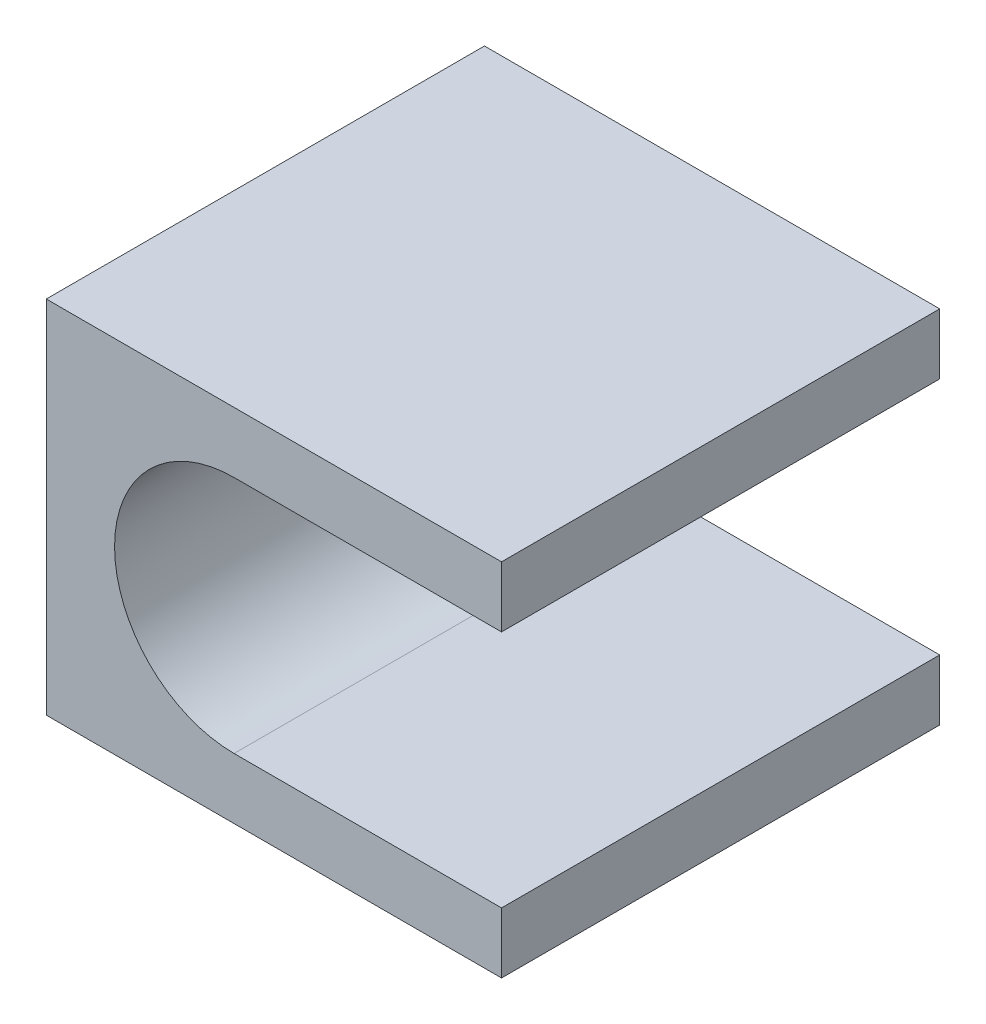
ISO-10303-21;
HEADER;
FILE_DESCRIPTION(('STEP AP214'),'2;1');
FILE_NAME('part.step','',(''),(''),'','','');
FILE_SCHEMA(('AUTOMOTIVE_DESIGN { 1 0 10303 214 1 1 1 1 }'));
ENDSEC;
DATA;
#1=APPLICATION_CONTEXT('core data for automotive mechanical design processes');
#2=APPLICATION_PROTOCOL_DEFINITION('international standard','automotive_design',2000,#1);
#3=PRODUCT_CONTEXT('',#1,'mechanical');
#4=PRODUCT('Part','Part','',(#3));
#5=PRODUCT_RELATED_PRODUCT_CATEGORY('part','',(#4));
#6=PRODUCT_DEFINITION_FORMATION('','',#4);
#7=PRODUCT_DEFINITION_CONTEXT('part definition',#1,'design');
#8=PRODUCT_DEFINITION('design','',#6,#7);
#9=PRODUCT_DEFINITION_SHAPE('','',#8);
#10=(LENGTH_UNIT() NAMED_UNIT(*) SI_UNIT(.MILLI.,.METRE.));
#11=(NAMED_UNIT(*) PLANE_ANGLE_UNIT() SI_UNIT($,.RADIAN.));
#12=(NAMED_UNIT(*) SI_UNIT($,.STERADIAN.) SOLID_ANGLE_UNIT());
#13=UNCERTAINTY_MEASURE_WITH_UNIT(LENGTH_MEASURE(1.E-05),#10,'distance_accuracy_value','');
#14=(GEOMETRIC_REPRESENTATION_CONTEXT(3) GLOBAL_UNCERTAINTY_ASSIGNED_CONTEXT((#13)) GLOBAL_UNIT_ASSIGNED_CONTEXT((#10,
#11,#12)) REPRESENTATION_CONTEXT('',''));
#15=CARTESIAN_POINT('',(0.,0.,0.));
#16=DIRECTION('',(0.,0.,1.));
#17=DIRECTION('',(1.,0.,0.));
#18=AXIS2_PLACEMENT_3D('',#15,#16,#17);
#19=CARTESIAN_POINT('',(12.,-9.5,33.));
#20=DIRECTION('',(-1.,0.,0.));
#21=DIRECTION('',(0.,0.,1.));
#22=AXIS2_PLACEMENT_3D('',#19,#20,#21);
#23=PLANE('',#22);
#24=DIRECTION('',(0.,0.,-1.));
#25=VECTOR('',#24,1.);
#26=CARTESIAN_POINT('',(12.,9.5,33.));
#27=LINE('',#26,#25);
#28=CARTESIAN_POINT('',(12.,9.5,23.1));
#29=VERTEX_POINT('',#28);
#30=CARTESIAN_POINT('',(12.,9.5,0.));
#31=VERTEX_POINT('',#30);
#32=EDGE_CURVE('E68',#29,#31,#27,.T.);
#33=ORIENTED_EDGE('',*,*,#32,.F.);
#34=DIRECTION('',(0.,-1.,0.));
#35=VECTOR('',#34,1.);
#36=CARTESIAN_POINT('',(12.,8.4,23.1));
#37=LINE('',#36,#35);
#38=CARTESIAN_POINT('',(12.,6.3,23.1));
#39=VERTEX_POINT('',#38);
#40=EDGE_CURVE('E122',#29,#39,#37,.T.);
#41=ORIENTED_EDGE('',*,*,#40,.T.);
#42=DIRECTION('',(0.,0.,1.));
#43=VECTOR('',#42,1.);
#44=CARTESIAN_POINT('',(12.,6.3,-0.001000000000001));
#45=LINE('',#44,#43);
#46=CARTESIAN_POINT('',(12.,6.3,0.));
#47=VERTEX_POINT('',#46);
#48=EDGE_CURVE('E60',#47,#39,#45,.T.);
#49=ORIENTED_EDGE('',*,*,#48,.F.);
#50=DIRECTION('',(0.,1.,0.));
#51=VECTOR('',#50,1.);
#52=CARTESIAN_POINT('',(12.,-9.5,0.));
#53=LINE('',#52,#51);
#54=EDGE_CURVE('E142',#47,#31,#53,.T.);
#55=ORIENTED_EDGE('',*,*,#54,.T.);
#56=EDGE_LOOP('',(#33,#41,#49,#55));
#57=FACE_BOUND('',#56,.T.);
#58=ADVANCED_FACE('F45',(#57),#23,.F.);
#59=CARTESIAN_POINT('',(12.,-6.3,23.1));
#60=VERTEX_POINT('',#59);
#61=CARTESIAN_POINT('',(12.,-9.5,23.1));
#62=VERTEX_POINT('',#61);
#63=EDGE_CURVE('E111',#60,#62,#37,.T.);
#64=ORIENTED_EDGE('',*,*,#63,.T.);
#65=DIRECTION('',(0.,0.,-1.));
#66=VECTOR('',#65,1.);
#67=CARTESIAN_POINT('',(12.,-9.5,33.));
#68=LINE('',#67,#66);
#69=CARTESIAN_POINT('',(12.,-9.5,0.));
#70=VERTEX_POINT('',#69);
#71=EDGE_CURVE('E116',#62,#70,#68,.T.);
#72=ORIENTED_EDGE('',*,*,#71,.T.);
#73=CARTESIAN_POINT('',(12.,-6.3,0.));
#74=VERTEX_POINT('',#73);
#75=EDGE_CURVE('E138',#70,#74,#53,.T.);
#76=ORIENTED_EDGE('',*,*,#75,.T.);
#77=DIRECTION('',(0.,0.,1.));
#78=VECTOR('',#77,1.);
#79=CARTESIAN_POINT('',(12.,-6.3,-0.001000000000001));
#80=LINE('',#79,#78);
#81=EDGE_CURVE('E118',#74,#60,#80,.T.);
#82=ORIENTED_EDGE('',*,*,#81,.T.);
#83=EDGE_LOOP('',(#64,#72,#76,#82));
#84=FACE_BOUND('',#83,.T.);
#85=ADVANCED_FACE('F113',(#84),#23,.F.);
#86=CARTESIAN_POINT('',(-12.,9.5,33.));
#87=DIRECTION('',(0.,-1.,0.));
#88=DIRECTION('',(0.,0.,-1.));
#89=AXIS2_PLACEMENT_3D('',#86,#87,#88);
#90=PLANE('',#89);
#91=DIRECTION('',(-1.,0.,0.));
#92=VECTOR('',#91,1.);
#93=CARTESIAN_POINT('',(-12.,9.5,23.1));
#94=LINE('',#93,#92);
#95=CARTESIAN_POINT('',(-12.,9.5,23.1));
#96=VERTEX_POINT('',#95);
#97=EDGE_CURVE('E131',#29,#96,#94,.T.);
#98=ORIENTED_EDGE('',*,*,#97,.F.);
#99=ORIENTED_EDGE('',*,*,#32,.T.);
#100=DIRECTION('',(-1.,0.,0.));
#101=VECTOR('',#100,1.);
#102=CARTESIAN_POINT('',(-12.,9.5,0.));
#103=LINE('',#102,#101);
#104=CARTESIAN_POINT('',(-12.,9.5,0.));
#105=VERTEX_POINT('',#104);
#106=EDGE_CURVE('E147',#31,#105,#103,.T.);
#107=ORIENTED_EDGE('',*,*,#106,.T.);
#108=DIRECTION('',(0.,0.,-1.));
#109=VECTOR('',#108,1.);
#110=CARTESIAN_POINT('',(-12.,9.5,33.));
#111=LINE('',#110,#109);
#112=EDGE_CURVE('E11',#96,#105,#111,.T.);
#113=ORIENTED_EDGE('',*,*,#112,.F.);
#114=EDGE_LOOP('',(#98,#99,#107,#113));
#115=FACE_BOUND('',#114,.T.);
#116=ADVANCED_FACE('F47',(#115),#90,.F.);
#117=CARTESIAN_POINT('',(-12.,-9.5,33.));
#118=DIRECTION('',(1.,0.,0.));
#119=DIRECTION('',(0.,0.,-1.));
#120=AXIS2_PLACEMENT_3D('',#117,#118,#119);
#121=PLANE('',#120);
#122=DIRECTION('',(0.,-1.,0.));
#123=VECTOR('',#122,1.);
#124=CARTESIAN_POINT('',(-12.,-9.5,23.1));
#125=LINE('',#124,#123);
#126=CARTESIAN_POINT('',(-12.,-9.5,23.1));
#127=VERTEX_POINT('',#126);
#128=EDGE_CURVE('E128',#96,#127,#125,.T.);
#129=ORIENTED_EDGE('',*,*,#128,.F.);
#130=ORIENTED_EDGE('',*,*,#112,.T.);
#131=DIRECTION('',(0.,-1.,0.));
#132=VECTOR('',#131,1.);
#133=CARTESIAN_POINT('',(-12.,-9.5,0.));
#134=LINE('',#133,#132);
#135=CARTESIAN_POINT('',(-12.,-9.5,0.));
#136=VERTEX_POINT('',#135);
#137=EDGE_CURVE('E144',#105,#136,#134,.T.);
#138=ORIENTED_EDGE('',*,*,#137,.T.);
#139=DIRECTION('',(0.,0.,-1.));
#140=VECTOR('',#139,1.);
#141=CARTESIAN_POINT('',(-12.,-9.5,33.));
#142=LINE('',#141,#140);
#143=EDGE_CURVE('E53',#127,#136,#142,.T.);
#144=ORIENTED_EDGE('',*,*,#143,.F.);
#145=EDGE_LOOP('',(#129,#130,#138,#144));
#146=FACE_BOUND('',#145,.T.);
#147=ADVANCED_FACE('F175',(#146),#121,.F.);
#148=CARTESIAN_POINT('',(-12.,-9.5,33.));
#149=DIRECTION('',(0.,1.,0.));
#150=DIRECTION('',(0.,0.,1.));
#151=AXIS2_PLACEMENT_3D('',#148,#149,#150);
#152=PLANE('',#151);
#153=DIRECTION('',(1.,0.,0.));
#154=VECTOR('',#153,1.);
#155=CARTESIAN_POINT('',(-12.,-9.5,23.1));
#156=LINE('',#155,#154);
#157=EDGE_CURVE('E125',#127,#62,#156,.T.);
#158=ORIENTED_EDGE('',*,*,#157,.F.);
#159=ORIENTED_EDGE('',*,*,#143,.T.);
#160=DIRECTION('',(1.,0.,0.));
#161=VECTOR('',#160,1.);
#162=CARTESIAN_POINT('',(-12.,-9.5,0.));
#163=LINE('',#162,#161);
#164=EDGE_CURVE('E135',#136,#70,#163,.T.);
#165=ORIENTED_EDGE('',*,*,#164,.T.);
#166=ORIENTED_EDGE('',*,*,#71,.F.);
#167=EDGE_LOOP('',(#158,#159,#165,#166));
#168=FACE_BOUND('',#167,.T.);
#169=ADVANCED_FACE('F133',(#168),#152,.F.);
#170=CARTESIAN_POINT('',(-2.1,-6.3,-0.001000000000001));
#171=DIRECTION('',(0.,-1.,0.));
#172=DIRECTION('',(0.,0.,-1.));
#173=AXIS2_PLACEMENT_3D('',#170,#171,#172);
#174=PLANE('',#173);
#175=ORIENTED_EDGE('',*,*,#81,.F.);
#176=DIRECTION('',(1.,0.,0.));
#177=VECTOR('',#176,1.);
#178=CARTESIAN_POINT('',(-2.1,-6.3,0.));
#179=LINE('',#178,#177);
#180=CARTESIAN_POINT('',(-2.1,-6.3,0.));
#181=VERTEX_POINT('',#180);
#182=EDGE_CURVE('E166',#181,#74,#179,.T.);
#183=ORIENTED_EDGE('',*,*,#182,.F.);
#184=DIRECTION('',(0.,0.,1.));
#185=VECTOR('',#184,1.);
#186=CARTESIAN_POINT('',(-2.1,-6.3,-0.001000000000001));
#187=LINE('',#186,#185);
#188=CARTESIAN_POINT('',(-2.1,-6.3,23.1));
#189=VERTEX_POINT('',#188);
#190=EDGE_CURVE('E154',#181,#189,#187,.T.);
#191=ORIENTED_EDGE('',*,*,#190,.T.);
#192=DIRECTION('',(1.,0.,0.));
#193=VECTOR('',#192,1.);
#194=CARTESIAN_POINT('',(-2.1,-6.3,23.1));
#195=LINE('',#194,#193);
#196=EDGE_CURVE('E152',#189,#60,#195,.T.);
#197=ORIENTED_EDGE('',*,*,#196,.T.);
#198=EDGE_LOOP('',(#175,#183,#191,#197));
#199=FACE_BOUND('',#198,.T.);
#200=ADVANCED_FACE('F184',(#199),#174,.F.);
#201=CARTESIAN_POINT('',(-2.1,0.,-0.001000000000001));
#202=DIRECTION('',(0.,0.,1.));
#203=DIRECTION('',(1.,0.,0.));
#204=AXIS2_PLACEMENT_3D('',#201,#202,#203);
#205=CYLINDRICAL_SURFACE('',#204,6.3);
#206=ORIENTED_EDGE('',*,*,#190,.F.);
#207=CARTESIAN_POINT('',(-2.1,0.,0.));
#208=DIRECTION('',(0.,0.,1.));
#209=DIRECTION('',(1.,0.,0.));
#210=AXIS2_PLACEMENT_3D('',#207,#208,#209);
#211=CIRCLE('',#210,6.3);
#212=CARTESIAN_POINT('',(-2.1,6.3,0.));
#213=VERTEX_POINT('',#212);
#214=EDGE_CURVE('E169',#213,#181,#211,.T.);
#215=ORIENTED_EDGE('',*,*,#214,.F.);
#216=DIRECTION('',(0.,0.,1.));
#217=VECTOR('',#216,1.);
#218=CARTESIAN_POINT('',(-2.1,6.3,-0.001000000000001));
#219=LINE('',#218,#217);
#220=CARTESIAN_POINT('',(-2.1,6.3,23.1));
#221=VERTEX_POINT('',#220);
#222=EDGE_CURVE('E151',#213,#221,#219,.T.);
#223=ORIENTED_EDGE('',*,*,#222,.T.);
#224=CARTESIAN_POINT('',(-2.1,0.,23.1));
#225=DIRECTION('',(0.,0.,1.));
#226=DIRECTION('',(1.,0.,0.));
#227=AXIS2_PLACEMENT_3D('',#224,#225,#226);
#228=CIRCLE('',#227,6.3);
#229=EDGE_CURVE('E158',#221,#189,#228,.T.);
#230=ORIENTED_EDGE('',*,*,#229,.T.);
#231=EDGE_LOOP('',(#206,#215,#223,#230));
#232=FACE_BOUND('',#231,.T.);
#233=ADVANCED_FACE('F187',(#232),#205,.F.);
#234=CARTESIAN_POINT('',(-2.1,6.3,-0.001000000000001));
#235=DIRECTION('',(0.,1.,0.));
#236=DIRECTION('',(-1.,0.,0.));
#237=AXIS2_PLACEMENT_3D('',#234,#235,#236);
#238=PLANE('',#237);
#239=ORIENTED_EDGE('',*,*,#222,.F.);
#240=DIRECTION('',(-1.,0.,0.));
#241=VECTOR('',#240,1.);
#242=CARTESIAN_POINT('',(12.,6.3,0.));
#243=LINE('',#242,#241);
#244=EDGE_CURVE('E163',#47,#213,#243,.T.);
#245=ORIENTED_EDGE('',*,*,#244,.F.);
#246=ORIENTED_EDGE('',*,*,#48,.T.);
#247=DIRECTION('',(-1.,0.,0.));
#248=VECTOR('',#247,1.);
#249=CARTESIAN_POINT('',(-2.1,6.3,23.1));
#250=LINE('',#249,#248);
#251=EDGE_CURVE('E161',#39,#221,#250,.T.);
#252=ORIENTED_EDGE('',*,*,#251,.T.);
#253=EDGE_LOOP('',(#239,#245,#246,#252));
#254=FACE_BOUND('',#253,.T.);
#255=ADVANCED_FACE('F188',(#254),#238,.F.);
#256=CARTESIAN_POINT('',(0.,0.,0.));
#257=DIRECTION('',(0.,0.,1.));
#258=DIRECTION('',(1.,0.,0.));
#259=AXIS2_PLACEMENT_3D('',#256,#257,#258);
#260=PLANE('',#259);
#261=ORIENTED_EDGE('',*,*,#54,.F.);
#262=ORIENTED_EDGE('',*,*,#244,.T.);
#263=ORIENTED_EDGE('',*,*,#214,.T.);
#264=ORIENTED_EDGE('',*,*,#182,.T.);
#265=ORIENTED_EDGE('',*,*,#75,.F.);
#266=ORIENTED_EDGE('',*,*,#164,.F.);
#267=ORIENTED_EDGE('',*,*,#137,.F.);
#268=ORIENTED_EDGE('',*,*,#106,.F.);
#269=EDGE_LOOP('',(#261,#262,#263,#264,#265,#266,#267,#268));
#270=FACE_BOUND('',#269,.T.);
#271=ADVANCED_FACE('F180',(#270),#260,.F.);
#272=CARTESIAN_POINT('',(-2.,0.,23.1));
#273=DIRECTION('',(0.,0.,1.));
#274=DIRECTION('',(1.,0.,0.));
#275=AXIS2_PLACEMENT_3D('',#272,#273,#274);
#276=PLANE('',#275);
#277=ORIENTED_EDGE('',*,*,#40,.F.);
#278=ORIENTED_EDGE('',*,*,#97,.T.);
#279=ORIENTED_EDGE('',*,*,#128,.T.);
#280=ORIENTED_EDGE('',*,*,#157,.T.);
#281=ORIENTED_EDGE('',*,*,#63,.F.);
#282=ORIENTED_EDGE('',*,*,#196,.F.);
#283=ORIENTED_EDGE('',*,*,#229,.F.);
#284=ORIENTED_EDGE('',*,*,#251,.F.);
#285=EDGE_LOOP('',(#277,#278,#279,#280,#281,#282,#283,#284));
#286=FACE_BOUND('',#285,.T.);
#287=ADVANCED_FACE('F126',(#286),#276,.T.);
#288=CLOSED_SHELL('',(#58,#85,#116,#147,#169,#200,#233,#255,#271,#287));
#289=MANIFOLD_SOLID_BREP('B2',#288);
#290=ADVANCED_BREP_SHAPE_REPRESENTATION('',(#18,#289),#14);
#291=SHAPE_DEFINITION_REPRESENTATION(#9,#290);
ENDSEC;
END-ISO-10303-21;
